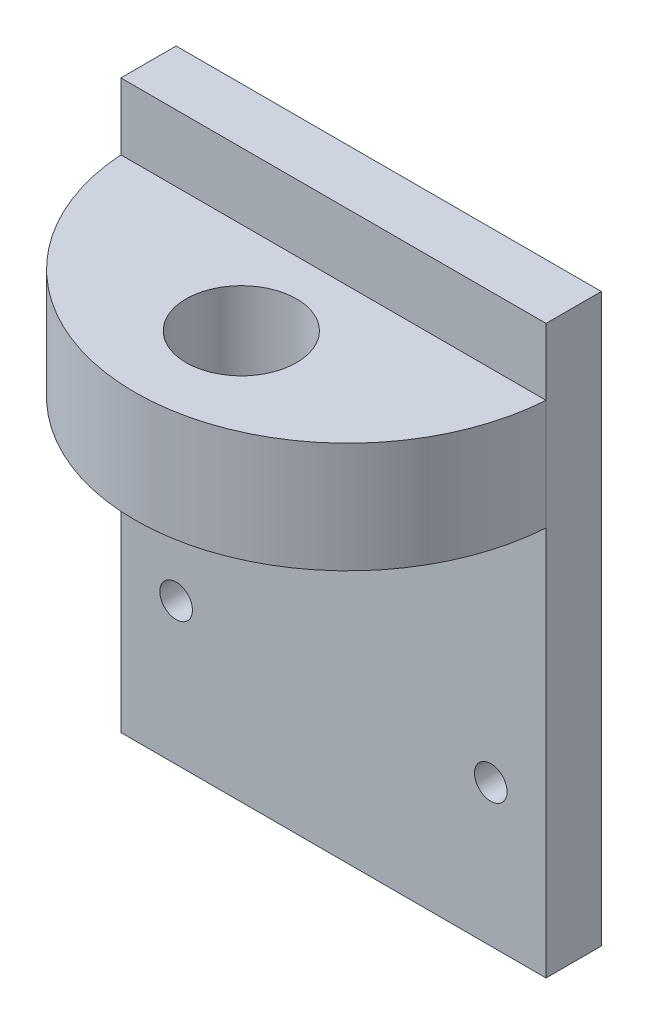
ISO-10303-21;
HEADER;
FILE_DESCRIPTION(('STEP AP214'),'2;1');
FILE_NAME('part.step','',(''),(''),'','','');
FILE_SCHEMA(('AUTOMOTIVE_DESIGN { 1 0 10303 214 1 1 1 1 }'));
ENDSEC;
DATA;
#1=APPLICATION_CONTEXT('core data for automotive mechanical design processes');
#2=APPLICATION_PROTOCOL_DEFINITION('international standard','automotive_design',2000,#1);
#3=PRODUCT_CONTEXT('',#1,'mechanical');
#4=PRODUCT('Part','Part','',(#3));
#5=PRODUCT_RELATED_PRODUCT_CATEGORY('part','',(#4));
#6=PRODUCT_DEFINITION_FORMATION('','',#4);
#7=PRODUCT_DEFINITION_CONTEXT('part definition',#1,'design');
#8=PRODUCT_DEFINITION('design','',#6,#7);
#9=PRODUCT_DEFINITION_SHAPE('','',#8);
#10=(LENGTH_UNIT() NAMED_UNIT(*) SI_UNIT(.MILLI.,.METRE.));
#11=(NAMED_UNIT(*) PLANE_ANGLE_UNIT() SI_UNIT($,.RADIAN.));
#12=(NAMED_UNIT(*) SI_UNIT($,.STERADIAN.) SOLID_ANGLE_UNIT());
#13=UNCERTAINTY_MEASURE_WITH_UNIT(LENGTH_MEASURE(1.E-05),#10,'distance_accuracy_value','');
#14=(GEOMETRIC_REPRESENTATION_CONTEXT(3) GLOBAL_UNCERTAINTY_ASSIGNED_CONTEXT((#13)) GLOBAL_UNIT_ASSIGNED_CONTEXT((#10,
#11,#12)) REPRESENTATION_CONTEXT('',''));
#15=CARTESIAN_POINT('',(0.,0.,0.));
#16=DIRECTION('',(0.,0.,1.));
#17=DIRECTION('',(1.,0.,0.));
#18=AXIS2_PLACEMENT_3D('',#15,#16,#17);
#19=CARTESIAN_POINT('',(-38.1,19.812,-2.58375411845882));
#20=DIRECTION('',(0.,-1.,0.));
#21=DIRECTION('',(0.,0.,-1.));
#22=AXIS2_PLACEMENT_3D('',#19,#20,#21);
#23=CYLINDRICAL_SURFACE('',#22,38.1875082369176);
#24=CARTESIAN_POINT('',(-38.1,0.,-2.58375411845882));
#25=DIRECTION('',(0.,1.,0.));
#26=DIRECTION('',(0.,0.,1.));
#27=AXIS2_PLACEMENT_3D('',#24,#25,#26);
#28=CIRCLE('',#27,38.1875082369176);
#29=CARTESIAN_POINT('',(0.,0.,0.));
#30=VERTEX_POINT('',#29);
#31=CARTESIAN_POINT('',(-76.2,0.,0.));
#32=VERTEX_POINT('',#31);
#33=EDGE_CURVE('E126',#30,#32,#28,.F.);
#34=ORIENTED_EDGE('',*,*,#33,.F.);
#35=DIRECTION('',(0.,-1.,0.));
#36=VECTOR('',#35,1.);
#37=CARTESIAN_POINT('',(0.,19.812,0.));
#38=LINE('',#37,#36);
#39=CARTESIAN_POINT('',(0.,19.812,0.));
#40=VERTEX_POINT('',#39);
#41=EDGE_CURVE('E11',#40,#30,#38,.T.);
#42=ORIENTED_EDGE('',*,*,#41,.F.);
#43=CARTESIAN_POINT('',(-38.1,19.812,-2.58375411845882));
#44=DIRECTION('',(0.,1.,0.));
#45=DIRECTION('',(0.,0.,1.));
#46=AXIS2_PLACEMENT_3D('',#43,#44,#45);
#47=CIRCLE('',#46,38.1875082369176);
#48=CARTESIAN_POINT('',(-76.2,19.812,0.));
#49=VERTEX_POINT('',#48);
#50=EDGE_CURVE('E136',#40,#49,#47,.F.);
#51=ORIENTED_EDGE('',*,*,#50,.T.);
#52=DIRECTION('',(0.,-1.,0.));
#53=VECTOR('',#52,1.);
#54=CARTESIAN_POINT('',(-76.2,19.812,0.));
#55=LINE('',#54,#53);
#56=EDGE_CURVE('E50',#49,#32,#55,.T.);
#57=ORIENTED_EDGE('',*,*,#56,.T.);
#58=EDGE_LOOP('',(#34,#42,#51,#57));
#59=FACE_BOUND('',#58,.T.);
#60=ADVANCED_FACE('F40',(#59),#23,.T.);
#61=CARTESIAN_POINT('',(-38.1,19.812,16.51));
#62=DIRECTION('',(0.,-1.,0.));
#63=DIRECTION('',(0.,0.,-1.));
#64=AXIS2_PLACEMENT_3D('',#61,#62,#63);
#65=CYLINDRICAL_SURFACE('',#64,9.906);
#66=CARTESIAN_POINT('',(-38.1,19.812,16.51));
#67=DIRECTION('',(0.,1.,0.));
#68=DIRECTION('',(0.,0.,1.));
#69=AXIS2_PLACEMENT_3D('',#66,#67,#68);
#70=CIRCLE('',#69,9.906);
#71=CARTESIAN_POINT('',(-38.1,19.812,26.416));
#72=VERTEX_POINT('',#71);
#73=EDGE_CURVE('E132',#72,#72,#70,.T.);
#74=ORIENTED_EDGE('',*,*,#73,.T.);
#75=EDGE_LOOP('',(#74));
#76=FACE_BOUND('',#75,.T.);
#77=CARTESIAN_POINT('',(-38.1,0.,16.51));
#78=DIRECTION('',(0.,1.,0.));
#79=DIRECTION('',(0.,0.,1.));
#80=AXIS2_PLACEMENT_3D('',#77,#78,#79);
#81=CIRCLE('',#80,9.906);
#82=CARTESIAN_POINT('',(-38.1,0.,26.416));
#83=VERTEX_POINT('',#82);
#84=EDGE_CURVE('E121',#83,#83,#81,.T.);
#85=ORIENTED_EDGE('',*,*,#84,.F.);
#86=EDGE_LOOP('',(#85));
#87=FACE_BOUND('',#86,.T.);
#88=ADVANCED_FACE('F42',(#76,#87),#65,.F.);
#89=CARTESIAN_POINT('',(0.,19.812,0.));
#90=DIRECTION('',(0.,1.,0.));
#91=DIRECTION('',(0.,0.,1.));
#92=AXIS2_PLACEMENT_3D('',#89,#90,#91);
#93=PLANE('',#92);
#94=ORIENTED_EDGE('',*,*,#73,.F.);
#95=EDGE_LOOP('',(#94));
#96=FACE_BOUND('',#95,.T.);
#97=ORIENTED_EDGE('',*,*,#50,.F.);
#98=DIRECTION('',(-1.,0.,0.));
#99=VECTOR('',#98,1.);
#100=CARTESIAN_POINT('',(0.,19.812,0.));
#101=LINE('',#100,#99);
#102=EDGE_CURVE('E56',#40,#49,#101,.T.);
#103=ORIENTED_EDGE('',*,*,#102,.T.);
#104=EDGE_LOOP('',(#97,#103));
#105=FACE_BOUND('',#104,.T.);
#106=ADVANCED_FACE('F229',(#96,#105),#93,.T.);
#107=CARTESIAN_POINT('',(0.,0.,0.));
#108=DIRECTION('',(0.,1.,0.));
#109=DIRECTION('',(0.,0.,1.));
#110=AXIS2_PLACEMENT_3D('',#107,#108,#109);
#111=PLANE('',#110);
#112=ORIENTED_EDGE('',*,*,#84,.T.);
#113=EDGE_LOOP('',(#112));
#114=FACE_BOUND('',#113,.T.);
#115=ORIENTED_EDGE('',*,*,#33,.T.);
#116=DIRECTION('',(-1.,0.,0.));
#117=VECTOR('',#116,1.);
#118=CARTESIAN_POINT('',(0.,0.,0.));
#119=LINE('',#118,#117);
#120=EDGE_CURVE('E137',#30,#32,#119,.T.);
#121=ORIENTED_EDGE('',*,*,#120,.F.);
#122=EDGE_LOOP('',(#115,#121));
#123=FACE_BOUND('',#122,.T.);
#124=ADVANCED_FACE('F221',(#114,#123),#111,.F.);
#125=CARTESIAN_POINT('',(0.,0.,0.));
#126=DIRECTION('',(0.,0.,-1.));
#127=DIRECTION('',(-1.,0.,0.));
#128=AXIS2_PLACEMENT_3D('',#125,#126,#127);
#129=PLANE('',#128);
#130=CARTESIAN_POINT('',(-9.90600000000001,-44.45,0.));
#131=DIRECTION('',(0.,0.,-1.));
#132=DIRECTION('',(-1.,0.,0.));
#133=AXIS2_PLACEMENT_3D('',#130,#131,#132);
#134=CIRCLE('',#133,2.921);
#135=CARTESIAN_POINT('',(-12.827,-44.45,0.));
#136=VERTEX_POINT('',#135);
#137=EDGE_CURVE('E175',#136,#136,#134,.T.);
#138=ORIENTED_EDGE('',*,*,#137,.T.);
#139=EDGE_LOOP('',(#138));
#140=FACE_BOUND('',#139,.T.);
#141=CARTESIAN_POINT('',(-66.294,-44.45,0.));
#142=DIRECTION('',(0.,0.,-1.));
#143=DIRECTION('',(-1.,0.,0.));
#144=AXIS2_PLACEMENT_3D('',#141,#142,#143);
#145=CIRCLE('',#144,2.92100000000001);
#146=CARTESIAN_POINT('',(-69.215,-44.45,0.));
#147=VERTEX_POINT('',#146);
#148=EDGE_CURVE('E113',#147,#147,#145,.F.);
#149=ORIENTED_EDGE('',*,*,#148,.F.);
#150=EDGE_LOOP('',(#149));
#151=FACE_BOUND('',#150,.T.);
#152=DIRECTION('',(0.,-1.,0.));
#153=VECTOR('',#152,1.);
#154=CARTESIAN_POINT('',(0.,0.,0.));
#155=LINE('',#154,#153);
#156=CARTESIAN_POINT('',(0.,-69.85,0.));
#157=VERTEX_POINT('',#156);
#158=EDGE_CURVE('E118',#30,#157,#155,.T.);
#159=ORIENTED_EDGE('',*,*,#158,.F.);
#160=ORIENTED_EDGE('',*,*,#120,.T.);
#161=DIRECTION('',(0.,-1.,0.));
#162=VECTOR('',#161,1.);
#163=CARTESIAN_POINT('',(-76.2,0.,0.));
#164=LINE('',#163,#162);
#165=CARTESIAN_POINT('',(-76.2,-69.85,0.));
#166=VERTEX_POINT('',#165);
#167=EDGE_CURVE('E158',#32,#166,#164,.T.);
#168=ORIENTED_EDGE('',*,*,#167,.T.);
#169=DIRECTION('',(-1.,0.,0.));
#170=VECTOR('',#169,1.);
#171=CARTESIAN_POINT('',(0.,-69.85,0.));
#172=LINE('',#171,#170);
#173=EDGE_CURVE('E163',#157,#166,#172,.T.);
#174=ORIENTED_EDGE('',*,*,#173,.F.);
#175=EDGE_LOOP('',(#159,#160,#168,#174));
#176=FACE_BOUND('',#175,.T.);
#177=ADVANCED_FACE('F157',(#140,#151,#176),#129,.F.);
#178=CARTESIAN_POINT('',(0.,0.,-9.906));
#179=DIRECTION('',(-1.,0.,0.));
#180=DIRECTION('',(0.,0.,1.));
#181=AXIS2_PLACEMENT_3D('',#178,#179,#180);
#182=PLANE('',#181);
#183=CARTESIAN_POINT('',(0.,31.75,0.));
#184=VERTEX_POINT('',#183);
#185=EDGE_CURVE('E168',#184,#40,#155,.T.);
#186=ORIENTED_EDGE('',*,*,#185,.T.);
#187=ORIENTED_EDGE('',*,*,#41,.T.);
#188=ORIENTED_EDGE('',*,*,#158,.T.);
#189=DIRECTION('',(0.,0.,1.));
#190=VECTOR('',#189,1.);
#191=CARTESIAN_POINT('',(0.,-69.85,-9.906));
#192=LINE('',#191,#190);
#193=CARTESIAN_POINT('',(0.,-69.85,-9.906));
#194=VERTEX_POINT('',#193);
#195=EDGE_CURVE('E95',#194,#157,#192,.T.);
#196=ORIENTED_EDGE('',*,*,#195,.F.);
#197=DIRECTION('',(0.,-1.,0.));
#198=VECTOR('',#197,1.);
#199=CARTESIAN_POINT('',(0.,0.,-9.906));
#200=LINE('',#199,#198);
#201=CARTESIAN_POINT('',(0.,31.75,-9.906));
#202=VERTEX_POINT('',#201);
#203=EDGE_CURVE('E103',#202,#194,#200,.T.);
#204=ORIENTED_EDGE('',*,*,#203,.F.);
#205=DIRECTION('',(0.,0.,1.));
#206=VECTOR('',#205,1.);
#207=CARTESIAN_POINT('',(0.,31.75,-9.906));
#208=LINE('',#207,#206);
#209=EDGE_CURVE('E182',#202,#184,#208,.T.);
#210=ORIENTED_EDGE('',*,*,#209,.T.);
#211=EDGE_LOOP('',(#186,#187,#188,#196,#204,#210));
#212=FACE_BOUND('',#211,.T.);
#213=ADVANCED_FACE('F116',(#212),#182,.F.);
#214=CARTESIAN_POINT('',(0.,-69.85,-9.906));
#215=DIRECTION('',(0.,1.,0.));
#216=DIRECTION('',(0.,0.,1.));
#217=AXIS2_PLACEMENT_3D('',#214,#215,#216);
#218=PLANE('',#217);
#219=ORIENTED_EDGE('',*,*,#173,.T.);
#220=DIRECTION('',(0.,0.,1.));
#221=VECTOR('',#220,1.);
#222=CARTESIAN_POINT('',(-76.2,-69.85,-9.90599999999999));
#223=LINE('',#222,#221);
#224=CARTESIAN_POINT('',(-76.2,-69.85,-9.90599999999999));
#225=VERTEX_POINT('',#224);
#226=EDGE_CURVE('E97',#225,#166,#223,.T.);
#227=ORIENTED_EDGE('',*,*,#226,.F.);
#228=DIRECTION('',(-1.,0.,0.));
#229=VECTOR('',#228,1.);
#230=CARTESIAN_POINT('',(0.,-69.85,-9.906));
#231=LINE('',#230,#229);
#232=EDGE_CURVE('E90',#194,#225,#231,.T.);
#233=ORIENTED_EDGE('',*,*,#232,.F.);
#234=ORIENTED_EDGE('',*,*,#195,.T.);
#235=EDGE_LOOP('',(#219,#227,#233,#234));
#236=FACE_BOUND('',#235,.T.);
#237=ADVANCED_FACE('F93',(#236),#218,.F.);
#238=CARTESIAN_POINT('',(-76.2,0.,-9.90599999999999));
#239=DIRECTION('',(-1.,0.,0.));
#240=DIRECTION('',(0.,0.,1.));
#241=AXIS2_PLACEMENT_3D('',#238,#239,#240);
#242=PLANE('',#241);
#243=CARTESIAN_POINT('',(-76.2,31.75,0.));
#244=VERTEX_POINT('',#243);
#245=EDGE_CURVE('E162',#244,#49,#164,.T.);
#246=ORIENTED_EDGE('',*,*,#245,.F.);
#247=DIRECTION('',(0.,0.,1.));
#248=VECTOR('',#247,1.);
#249=CARTESIAN_POINT('',(-76.2,31.75,-9.90599999999999));
#250=LINE('',#249,#248);
#251=CARTESIAN_POINT('',(-76.2,31.75,-9.90599999999999));
#252=VERTEX_POINT('',#251);
#253=EDGE_CURVE('E128',#252,#244,#250,.T.);
#254=ORIENTED_EDGE('',*,*,#253,.F.);
#255=DIRECTION('',(0.,-1.,0.));
#256=VECTOR('',#255,1.);
#257=CARTESIAN_POINT('',(-76.2,0.,-9.90599999999999));
#258=LINE('',#257,#256);
#259=EDGE_CURVE('E102',#252,#225,#258,.T.);
#260=ORIENTED_EDGE('',*,*,#259,.T.);
#261=ORIENTED_EDGE('',*,*,#226,.T.);
#262=ORIENTED_EDGE('',*,*,#167,.F.);
#263=ORIENTED_EDGE('',*,*,#56,.F.);
#264=EDGE_LOOP('',(#246,#254,#260,#261,#262,#263));
#265=FACE_BOUND('',#264,.T.);
#266=ADVANCED_FACE('F160',(#265),#242,.T.);
#267=CARTESIAN_POINT('',(-9.90600000000001,-44.45,-9.906));
#268=DIRECTION('',(0.,0.,1.));
#269=DIRECTION('',(1.,0.,0.));
#270=AXIS2_PLACEMENT_3D('',#267,#268,#269);
#271=CYLINDRICAL_SURFACE('',#270,2.921);
#272=CARTESIAN_POINT('',(-9.90600000000001,-44.45,-9.906));
#273=DIRECTION('',(0.,0.,-1.));
#274=DIRECTION('',(-1.,0.,0.));
#275=AXIS2_PLACEMENT_3D('',#272,#273,#274);
#276=CIRCLE('',#275,2.921);
#277=CARTESIAN_POINT('',(-12.827,-44.45,-9.906));
#278=VERTEX_POINT('',#277);
#279=EDGE_CURVE('E198',#278,#278,#276,.T.);
#280=ORIENTED_EDGE('',*,*,#279,.T.);
#281=EDGE_LOOP('',(#280));
#282=FACE_BOUND('',#281,.T.);
#283=ORIENTED_EDGE('',*,*,#137,.F.);
#284=EDGE_LOOP('',(#283));
#285=FACE_BOUND('',#284,.T.);
#286=ADVANCED_FACE('F207',(#282,#285),#271,.F.);
#287=CARTESIAN_POINT('',(0.,31.75,-9.906));
#288=DIRECTION('',(0.,1.,0.));
#289=DIRECTION('',(0.,0.,1.));
#290=AXIS2_PLACEMENT_3D('',#287,#288,#289);
#291=PLANE('',#290);
#292=DIRECTION('',(-1.,0.,0.));
#293=VECTOR('',#292,1.);
#294=CARTESIAN_POINT('',(0.,31.75,0.));
#295=LINE('',#294,#293);
#296=EDGE_CURVE('E167',#184,#244,#295,.T.);
#297=ORIENTED_EDGE('',*,*,#296,.F.);
#298=ORIENTED_EDGE('',*,*,#209,.F.);
#299=DIRECTION('',(-1.,0.,0.));
#300=VECTOR('',#299,1.);
#301=CARTESIAN_POINT('',(0.,31.75,-9.906));
#302=LINE('',#301,#300);
#303=EDGE_CURVE('E110',#202,#252,#302,.T.);
#304=ORIENTED_EDGE('',*,*,#303,.T.);
#305=ORIENTED_EDGE('',*,*,#253,.T.);
#306=EDGE_LOOP('',(#297,#298,#304,#305));
#307=FACE_BOUND('',#306,.T.);
#308=ADVANCED_FACE('F188',(#307),#291,.T.);
#309=CARTESIAN_POINT('',(-66.294,-44.45,-9.90599999999999));
#310=DIRECTION('',(0.,0.,1.));
#311=DIRECTION('',(1.,0.,0.));
#312=AXIS2_PLACEMENT_3D('',#309,#310,#311);
#313=CYLINDRICAL_SURFACE('',#312,2.92100000000001);
#314=CARTESIAN_POINT('',(-66.294,-44.45,-9.90599999999999));
#315=DIRECTION('',(0.,0.,-1.));
#316=DIRECTION('',(-1.,0.,0.));
#317=AXIS2_PLACEMENT_3D('',#314,#315,#316);
#318=CIRCLE('',#317,2.92100000000001);
#319=CARTESIAN_POINT('',(-69.215,-44.45,-9.90599999999999));
#320=VERTEX_POINT('',#319);
#321=EDGE_CURVE('E184',#320,#320,#318,.F.);
#322=ORIENTED_EDGE('',*,*,#321,.F.);
#323=EDGE_LOOP('',(#322));
#324=FACE_BOUND('',#323,.T.);
#325=ORIENTED_EDGE('',*,*,#148,.T.);
#326=EDGE_LOOP('',(#325));
#327=FACE_BOUND('',#326,.T.);
#328=ADVANCED_FACE('F211',(#324,#327),#313,.F.);
#329=CARTESIAN_POINT('',(0.,0.,-9.906));
#330=DIRECTION('',(0.,0.,-1.));
#331=DIRECTION('',(-1.,0.,0.));
#332=AXIS2_PLACEMENT_3D('',#329,#330,#331);
#333=PLANE('',#332);
#334=ORIENTED_EDGE('',*,*,#203,.T.);
#335=ORIENTED_EDGE('',*,*,#232,.T.);
#336=ORIENTED_EDGE('',*,*,#259,.F.);
#337=ORIENTED_EDGE('',*,*,#303,.F.);
#338=EDGE_LOOP('',(#334,#335,#336,#337));
#339=FACE_BOUND('',#338,.T.);
#340=ORIENTED_EDGE('',*,*,#279,.F.);
#341=EDGE_LOOP('',(#340));
#342=FACE_BOUND('',#341,.T.);
#343=ORIENTED_EDGE('',*,*,#321,.T.);
#344=EDGE_LOOP('',(#343));
#345=FACE_BOUND('',#344,.T.);
#346=ADVANCED_FACE('F107',(#339,#342,#345),#333,.T.);
#347=ORIENTED_EDGE('',*,*,#102,.F.);
#348=ORIENTED_EDGE('',*,*,#185,.F.);
#349=ORIENTED_EDGE('',*,*,#296,.T.);
#350=ORIENTED_EDGE('',*,*,#245,.T.);
#351=EDGE_LOOP('',(#347,#348,#349,#350));
#352=FACE_BOUND('',#351,.T.);
#353=ADVANCED_FACE('F191',(#352),#129,.F.);
#354=CLOSED_SHELL('',(#60,#88,#106,#124,#177,#213,#237,#266,#286,#308,#328,#346,#353));
#355=MANIFOLD_SOLID_BREP('B2',#354);
#356=ADVANCED_BREP_SHAPE_REPRESENTATION('',(#18,#355),#14);
#357=SHAPE_DEFINITION_REPRESENTATION(#9,#356);
ENDSEC;
END-ISO-10303-21;
